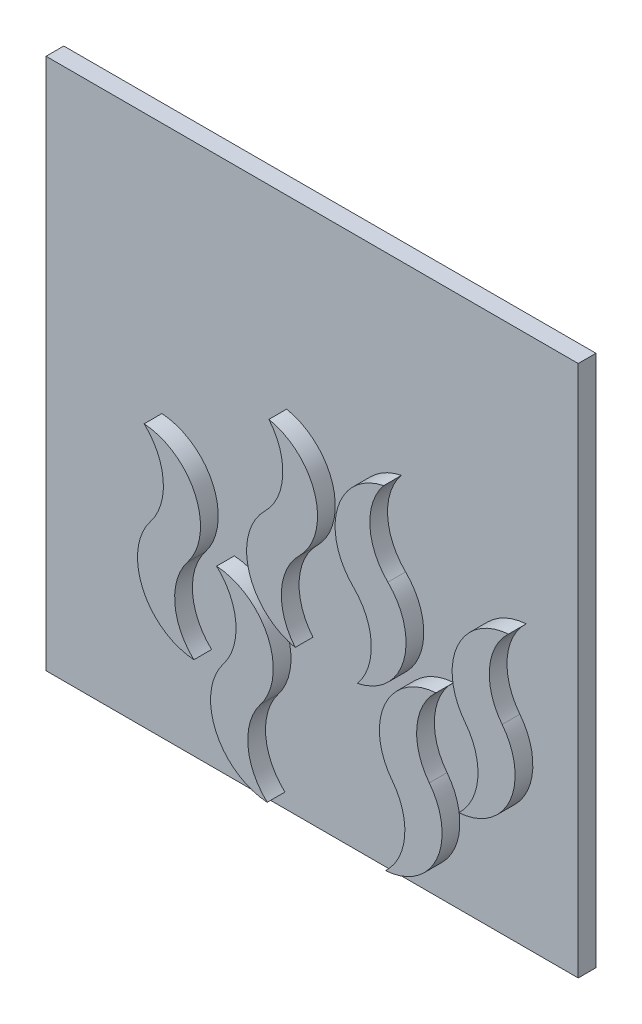
ISO-10303-21;
HEADER;
FILE_DESCRIPTION(('STEP AP214'),'2;1');
FILE_NAME('part.step','',(''),(''),'','','');
FILE_SCHEMA(('AUTOMOTIVE_DESIGN { 1 0 10303 214 1 1 1 1 }'));
ENDSEC;
DATA;
#1=APPLICATION_CONTEXT('core data for automotive mechanical design processes');
#2=APPLICATION_PROTOCOL_DEFINITION('international standard','automotive_design',2000,#1);
#3=PRODUCT_CONTEXT('',#1,'mechanical');
#4=PRODUCT('Part','Part','',(#3));
#5=PRODUCT_RELATED_PRODUCT_CATEGORY('part','',(#4));
#6=PRODUCT_DEFINITION_FORMATION('','',#4);
#7=PRODUCT_DEFINITION_CONTEXT('part definition',#1,'design');
#8=PRODUCT_DEFINITION('design','',#6,#7);
#9=PRODUCT_DEFINITION_SHAPE('','',#8);
#10=(LENGTH_UNIT() NAMED_UNIT(*) SI_UNIT(.MILLI.,.METRE.));
#11=(NAMED_UNIT(*) PLANE_ANGLE_UNIT() SI_UNIT($,.RADIAN.));
#12=(NAMED_UNIT(*) SI_UNIT($,.STERADIAN.) SOLID_ANGLE_UNIT());
#13=UNCERTAINTY_MEASURE_WITH_UNIT(LENGTH_MEASURE(1.E-05),#10,'distance_accuracy_value','');
#14=(GEOMETRIC_REPRESENTATION_CONTEXT(3) GLOBAL_UNCERTAINTY_ASSIGNED_CONTEXT((#13)) GLOBAL_UNIT_ASSIGNED_CONTEXT((#10,
#11,#12)) REPRESENTATION_CONTEXT('',''));
#15=CARTESIAN_POINT('',(0.,0.,0.));
#16=DIRECTION('',(0.,0.,1.));
#17=DIRECTION('',(1.,0.,0.));
#18=AXIS2_PLACEMENT_3D('',#15,#16,#17);
#19=CARTESIAN_POINT('',(0.,0.,10.));
#20=DIRECTION('',(0.,0.,-1.));
#21=DIRECTION('',(-1.,0.,0.));
#22=AXIS2_PLACEMENT_3D('',#19,#20,#21);
#23=PLANE('',#22);
#24=CARTESIAN_POINT('',(226.521788907777,173.848705090708,10.));
#25=DIRECTION('',(0.,0.,-1.));
#26=DIRECTION('',(-1.,0.,0.));
#27=AXIS2_PLACEMENT_3D('',#24,#25,#26);
#28=CIRCLE('',#27,34.0058100788832);
#29=CARTESIAN_POINT('',(202.692247838287,149.588694960072,10.));
#30=VERTEX_POINT('',#29);
#31=CARTESIAN_POINT('',(200.348155145126,195.558979496613,10.));
#32=VERTEX_POINT('',#31);
#33=EDGE_CURVE('E229',#30,#32,#28,.T.);
#34=ORIENTED_EDGE('',*,*,#33,.F.);
#35=CARTESIAN_POINT('',(178.6971316033,125.160118629163,10.));
#36=DIRECTION('',(0.,0.,1.));
#37=DIRECTION('',(-1.,0.,0.));
#38=AXIS2_PLACEMENT_3D('',#35,#36,#37);
#39=CIRCLE('',#38,34.2420931703302);
#40=CARTESIAN_POINT('',(185.539126914538,91.6085457175006,10.));
#41=VERTEX_POINT('',#40);
#42=EDGE_CURVE('E232',#41,#30,#39,.T.);
#43=ORIENTED_EDGE('',*,*,#42,.F.);
#44=CARTESIAN_POINT('',(159.365493151887,113.318820123406,10.));
#45=DIRECTION('',(0.,0.,-1.));
#46=DIRECTION('',(-1.,0.,0.));
#47=AXIS2_PLACEMENT_3D('',#44,#45,#46);
#48=CIRCLE('',#47,34.0058100788832);
#49=CARTESIAN_POINT('',(183.195034221377,137.578830254042,10.));
#50=VERTEX_POINT('',#49);
#51=EDGE_CURVE('E68',#50,#41,#48,.T.);
#52=ORIENTED_EDGE('',*,*,#51,.F.);
#53=CARTESIAN_POINT('',(207.190150456364,162.007406584951,10.));
#54=DIRECTION('',(0.,0.,1.));
#55=DIRECTION('',(-1.,0.,0.));
#56=AXIS2_PLACEMENT_3D('',#53,#54,#55);
#57=CIRCLE('',#56,34.2420931703302);
#58=EDGE_CURVE('E63',#32,#50,#57,.T.);
#59=ORIENTED_EDGE('',*,*,#58,.F.);
#60=EDGE_LOOP('',(#34,#43,#52,#59));
#61=FACE_BOUND('',#60,.T.);
#62=CARTESIAN_POINT('',(252.901161003334,84.1522893217765,10.));
#63=DIRECTION('',(0.,0.,-1.));
#64=DIRECTION('',(-1.,0.,0.));
#65=AXIS2_PLACEMENT_3D('',#62,#63,#64);
#66=CIRCLE('',#65,34.0058100788831);
#67=CARTESIAN_POINT('',(226.051898305142,63.2833599844937,10.));
#68=VERTEX_POINT('',#67);
#69=CARTESIAN_POINT('',(229.853318045369,109.156130108864,10.));
#70=VERTEX_POINT('',#69);
#71=EDGE_CURVE('E306',#68,#70,#66,.T.);
#72=ORIENTED_EDGE('',*,*,#71,.F.);
#73=CARTESIAN_POINT('',(199.01607846337,42.2694267455962,10.));
#74=DIRECTION('',(0.,0.,1.));
#75=DIRECTION('',(-1.,0.,0.));
#76=AXIS2_PLACEMENT_3D('',#73,#74,#75);
#77=CIRCLE('',#76,34.2420931703302);
#78=CARTESIAN_POINT('',(201.327006661684,8.10540245764366,10.));
#79=VERTEX_POINT('',#78);
#80=EDGE_CURVE('E293',#79,#68,#77,.T.);
#81=ORIENTED_EDGE('',*,*,#80,.F.);
#82=CARTESIAN_POINT('',(178.279163703718,33.109243244731,10.));
#83=DIRECTION('',(0.,0.,-1.));
#84=DIRECTION('',(-1.,0.,0.));
#85=AXIS2_PLACEMENT_3D('',#82,#83,#84);
#86=CIRCLE('',#85,34.0058100788832);
#87=CARTESIAN_POINT('',(205.128426401911,53.9781725820139,10.));
#88=VERTEX_POINT('',#87);
#89=EDGE_CURVE('E297',#88,#79,#86,.T.);
#90=ORIENTED_EDGE('',*,*,#89,.F.);
#91=CARTESIAN_POINT('',(232.164246243683,74.9921058209113,10.));
#92=DIRECTION('',(0.,0.,1.));
#93=DIRECTION('',(-1.,0.,0.));
#94=AXIS2_PLACEMENT_3D('',#91,#92,#93);
#95=CIRCLE('',#94,34.2420931703302);
#96=EDGE_CURVE('E302',#70,#88,#95,.T.);
#97=ORIENTED_EDGE('',*,*,#96,.F.);
#98=EDGE_LOOP('',(#72,#81,#90,#97));
#99=FACE_BOUND('',#98,.T.);
#100=CARTESIAN_POINT('',(103.835753756317,74.9921058209113,10.));
#101=DIRECTION('',(0.,0.,1.));
#102=DIRECTION('',(1.,0.,0.));
#103=AXIS2_PLACEMENT_3D('',#100,#101,#102);
#104=CIRCLE('',#103,34.2420931703302);
#105=CARTESIAN_POINT('',(130.871573598089,53.9781725820139,10.));
#106=VERTEX_POINT('',#105);
#107=CARTESIAN_POINT('',(106.146681954631,109.156130108864,10.));
#108=VERTEX_POINT('',#107);
#109=EDGE_CURVE('E396',#106,#108,#104,.T.);
#110=ORIENTED_EDGE('',*,*,#109,.F.);
#111=CARTESIAN_POINT('',(157.720836296282,33.109243244731,10.));
#112=DIRECTION('',(0.,0.,-1.));
#113=DIRECTION('',(1.,0.,0.));
#114=AXIS2_PLACEMENT_3D('',#111,#112,#113);
#115=CIRCLE('',#114,34.0058100788832);
#116=CARTESIAN_POINT('',(134.672993338316,8.10540245764366,10.));
#117=VERTEX_POINT('',#116);
#118=EDGE_CURVE('E383',#117,#106,#115,.T.);
#119=ORIENTED_EDGE('',*,*,#118,.F.);
#120=CARTESIAN_POINT('',(136.98392153663,42.2694267455962,10.));
#121=DIRECTION('',(0.,0.,1.));
#122=DIRECTION('',(1.,0.,0.));
#123=AXIS2_PLACEMENT_3D('',#120,#121,#122);
#124=CIRCLE('',#123,34.2420931703302);
#125=CARTESIAN_POINT('',(109.948101694858,63.2833599844937,10.));
#126=VERTEX_POINT('',#125);
#127=EDGE_CURVE('E387',#126,#117,#124,.T.);
#128=ORIENTED_EDGE('',*,*,#127,.F.);
#129=CARTESIAN_POINT('',(83.0988389966655,84.1522893217765,10.));
#130=DIRECTION('',(0.,0.,-1.));
#131=DIRECTION('',(1.,0.,0.));
#132=AXIS2_PLACEMENT_3D('',#129,#130,#131);
#133=CIRCLE('',#132,34.0058100788831);
#134=EDGE_CURVE('E392',#108,#126,#133,.T.);
#135=ORIENTED_EDGE('',*,*,#134,.F.);
#136=EDGE_LOOP('',(#110,#119,#128,#135));
#137=FACE_BOUND('',#136,.T.);
#138=CARTESIAN_POINT('',(219.495258599594,81.9190017693389,10.));
#139=DIRECTION('',(0.,0.,-1.));
#140=DIRECTION('',(-1.,0.,0.));
#141=AXIS2_PLACEMENT_3D('',#138,#139,#140);
#142=CIRCLE('',#141,34.0058100788832);
#143=CARTESIAN_POINT('',(246.236441483387,102.926244736863,10.));
#144=VERTEX_POINT('',#143);
#145=CARTESIAN_POINT('',(242.671860382951,57.0344634192557,10.));
#146=VERTEX_POINT('',#145);
#147=EDGE_CURVE('E441',#144,#146,#142,.T.);
#148=ORIENTED_EDGE('',*,*,#147,.F.);
#149=CARTESIAN_POINT('',(273.163430538128,124.079452652719,10.));
#150=DIRECTION('',(0.,0.,1.));
#151=DIRECTION('',(-1.,0.,0.));
#152=AXIS2_PLACEMENT_3D('',#149,#150,#151);
#153=CIRCLE('',#152,34.2420931703302);
#154=CARTESIAN_POINT('',(270.67618382826,158.231093147575,10.));
#155=VERTEX_POINT('',#154);
#156=EDGE_CURVE('E428',#155,#144,#153,.T.);
#157=ORIENTED_EDGE('',*,*,#156,.F.);
#158=CARTESIAN_POINT('',(293.852785611618,133.346554797491,10.));
#159=DIRECTION('',(0.,0.,-1.));
#160=DIRECTION('',(-1.,0.,0.));
#161=AXIS2_PLACEMENT_3D('',#158,#159,#160);
#162=CIRCLE('',#161,34.0058100788832);
#163=CARTESIAN_POINT('',(267.111602727824,112.339311829967,10.));
#164=VERTEX_POINT('',#163);
#165=EDGE_CURVE('E432',#164,#155,#162,.T.);
#166=ORIENTED_EDGE('',*,*,#165,.F.);
#167=CARTESIAN_POINT('',(240.184613673084,91.1861039141109,10.));
#168=DIRECTION('',(0.,0.,1.));
#169=DIRECTION('',(-1.,0.,0.));
#170=AXIS2_PLACEMENT_3D('',#167,#168,#169);
#171=CIRCLE('',#170,34.2420931703302);
#172=EDGE_CURVE('E437',#146,#164,#171,.T.);
#173=ORIENTED_EDGE('',*,*,#172,.F.);
#174=EDGE_LOOP('',(#148,#157,#166,#173));
#175=FACE_BOUND('',#174,.T.);
#176=DIRECTION('',(0.,-1.,0.));
#177=VECTOR('',#176,1.);
#178=CARTESIAN_POINT('',(0.,0.,10.));
#179=LINE('',#178,#177);
#180=CARTESIAN_POINT('',(0.,300.,10.));
#181=VERTEX_POINT('',#180);
#182=CARTESIAN_POINT('',(0.,0.,10.));
#183=VERTEX_POINT('',#182);
#184=EDGE_CURVE('E502',#181,#183,#179,.T.);
#185=ORIENTED_EDGE('',*,*,#184,.T.);
#186=DIRECTION('',(1.,0.,0.));
#187=VECTOR('',#186,1.);
#188=CARTESIAN_POINT('',(0.,0.,10.));
#189=LINE('',#188,#187);
#190=CARTESIAN_POINT('',(300.,0.,10.));
#191=VERTEX_POINT('',#190);
#192=EDGE_CURVE('E506',#183,#191,#189,.T.);
#193=ORIENTED_EDGE('',*,*,#192,.T.);
#194=DIRECTION('',(0.,1.,0.));
#195=VECTOR('',#194,1.);
#196=CARTESIAN_POINT('',(300.,0.,10.));
#197=LINE('',#196,#195);
#198=CARTESIAN_POINT('',(300.,300.,10.));
#199=VERTEX_POINT('',#198);
#200=EDGE_CURVE('E510',#191,#199,#197,.T.);
#201=ORIENTED_EDGE('',*,*,#200,.T.);
#202=DIRECTION('',(-1.,0.,0.));
#203=VECTOR('',#202,1.);
#204=CARTESIAN_POINT('',(0.,300.,10.));
#205=LINE('',#204,#203);
#206=EDGE_CURVE('E513',#199,#181,#205,.T.);
#207=ORIENTED_EDGE('',*,*,#206,.T.);
#208=EDGE_LOOP('',(#185,#193,#201,#207));
#209=FACE_BOUND('',#208,.T.);
#210=CARTESIAN_POINT('',(62.8365694618724,124.079452652719,10.));
#211=DIRECTION('',(0.,0.,1.));
#212=DIRECTION('',(1.,0.,0.));
#213=AXIS2_PLACEMENT_3D('',#210,#211,#212);
#214=CIRCLE('',#213,34.2420931703302);
#215=CARTESIAN_POINT('',(89.7635585166133,102.926244736863,10.));
#216=VERTEX_POINT('',#215);
#217=CARTESIAN_POINT('',(65.3238161717396,158.231093147575,10.));
#218=VERTEX_POINT('',#217);
#219=EDGE_CURVE('E445',#216,#218,#214,.T.);
#220=ORIENTED_EDGE('',*,*,#219,.F.);
#221=CARTESIAN_POINT('',(116.504741400406,81.9190017693389,10.));
#222=DIRECTION('',(0.,0.,-1.));
#223=DIRECTION('',(1.,0.,0.));
#224=AXIS2_PLACEMENT_3D('',#221,#222,#223);
#225=CIRCLE('',#224,34.0058100788832);
#226=CARTESIAN_POINT('',(93.3281396170492,57.0344634192557,10.));
#227=VERTEX_POINT('',#226);
#228=EDGE_CURVE('E462',#227,#216,#225,.T.);
#229=ORIENTED_EDGE('',*,*,#228,.F.);
#230=CARTESIAN_POINT('',(95.8153863269165,91.1861039141109,10.));
#231=DIRECTION('',(0.,0.,1.));
#232=DIRECTION('',(1.,0.,0.));
#233=AXIS2_PLACEMENT_3D('',#230,#231,#232);
#234=CIRCLE('',#233,34.2420931703302);
#235=CARTESIAN_POINT('',(68.8883972721756,112.339311829967,10.));
#236=VERTEX_POINT('',#235);
#237=EDGE_CURVE('E479',#236,#227,#234,.T.);
#238=ORIENTED_EDGE('',*,*,#237,.F.);
#239=CARTESIAN_POINT('',(42.1472143883825,133.346554797491,10.));
#240=DIRECTION('',(0.,0.,-1.));
#241=DIRECTION('',(1.,0.,0.));
#242=AXIS2_PLACEMENT_3D('',#239,#240,#241);
#243=CIRCLE('',#242,34.0058100788832);
#244=EDGE_CURVE('E475',#218,#236,#243,.T.);
#245=ORIENTED_EDGE('',*,*,#244,.F.);
#246=EDGE_LOOP('',(#220,#229,#238,#245));
#247=FACE_BOUND('',#246,.T.);
#248=CARTESIAN_POINT('',(128.809849543636,162.007406584951,10.));
#249=DIRECTION('',(0.,0.,1.));
#250=DIRECTION('',(1.,0.,0.));
#251=AXIS2_PLACEMENT_3D('',#248,#249,#250);
#252=CIRCLE('',#251,34.2420931703302);
#253=CARTESIAN_POINT('',(152.804965778623,137.578830254042,10.));
#254=VERTEX_POINT('',#253);
#255=CARTESIAN_POINT('',(135.651844854874,195.558979496613,10.));
#256=VERTEX_POINT('',#255);
#257=EDGE_CURVE('E351',#254,#256,#252,.T.);
#258=ORIENTED_EDGE('',*,*,#257,.F.);
#259=CARTESIAN_POINT('',(176.634506848113,113.318820123406,10.));
#260=DIRECTION('',(0.,0.,-1.));
#261=DIRECTION('',(1.,0.,0.));
#262=AXIS2_PLACEMENT_3D('',#259,#260,#261);
#263=CIRCLE('',#262,34.0058100788832);
#264=CARTESIAN_POINT('',(150.460873085462,91.6085457175005,10.));
#265=VERTEX_POINT('',#264);
#266=EDGE_CURVE('E338',#265,#254,#263,.T.);
#267=ORIENTED_EDGE('',*,*,#266,.F.);
#268=CARTESIAN_POINT('',(157.3028683967,125.160118629163,10.));
#269=DIRECTION('',(0.,0.,1.));
#270=DIRECTION('',(1.,0.,0.));
#271=AXIS2_PLACEMENT_3D('',#268,#269,#270);
#272=CIRCLE('',#271,34.2420931703302);
#273=CARTESIAN_POINT('',(133.307752161713,149.588694960072,10.));
#274=VERTEX_POINT('',#273);
#275=EDGE_CURVE('E342',#274,#265,#272,.T.);
#276=ORIENTED_EDGE('',*,*,#275,.F.);
#277=CARTESIAN_POINT('',(109.478211092223,173.848705090708,10.));
#278=DIRECTION('',(0.,0.,-1.));
#279=DIRECTION('',(1.,0.,0.));
#280=AXIS2_PLACEMENT_3D('',#277,#278,#279);
#281=CIRCLE('',#280,34.0058100788832);
#282=EDGE_CURVE('E347',#256,#274,#281,.T.);
#283=ORIENTED_EDGE('',*,*,#282,.F.);
#284=EDGE_LOOP('',(#258,#267,#276,#283));
#285=FACE_BOUND('',#284,.T.);
#286=ADVANCED_FACE('F47',(#61,#99,#137,#175,#209,#247,#285),#23,.F.);
#287=CARTESIAN_POINT('',(0.,0.,10.));
#288=DIRECTION('',(1.,0.,0.));
#289=DIRECTION('',(0.,0.,-1.));
#290=AXIS2_PLACEMENT_3D('',#287,#288,#289);
#291=PLANE('',#290);
#292=DIRECTION('',(0.,-1.,0.));
#293=VECTOR('',#292,1.);
#294=CARTESIAN_POINT('',(0.,0.,0.));
#295=LINE('',#294,#293);
#296=CARTESIAN_POINT('',(0.,300.,0.));
#297=VERTEX_POINT('',#296);
#298=CARTESIAN_POINT('',(0.,0.,0.));
#299=VERTEX_POINT('',#298);
#300=EDGE_CURVE('E501',#297,#299,#295,.T.);
#301=ORIENTED_EDGE('',*,*,#300,.T.);
#302=DIRECTION('',(0.,0.,-1.));
#303=VECTOR('',#302,1.);
#304=CARTESIAN_POINT('',(0.,0.,10.));
#305=LINE('',#304,#303);
#306=EDGE_CURVE('E11',#183,#299,#305,.T.);
#307=ORIENTED_EDGE('',*,*,#306,.F.);
#308=ORIENTED_EDGE('',*,*,#184,.F.);
#309=DIRECTION('',(0.,0.,-1.));
#310=VECTOR('',#309,1.);
#311=CARTESIAN_POINT('',(0.,300.,10.));
#312=LINE('',#311,#310);
#313=EDGE_CURVE('E516',#181,#297,#312,.T.);
#314=ORIENTED_EDGE('',*,*,#313,.T.);
#315=EDGE_LOOP('',(#301,#307,#308,#314));
#316=FACE_BOUND('',#315,.T.);
#317=ADVANCED_FACE('F49',(#316),#291,.F.);
#318=CARTESIAN_POINT('',(0.,0.,10.));
#319=DIRECTION('',(0.,1.,0.));
#320=DIRECTION('',(0.,0.,1.));
#321=AXIS2_PLACEMENT_3D('',#318,#319,#320);
#322=PLANE('',#321);
#323=DIRECTION('',(1.,0.,0.));
#324=VECTOR('',#323,1.);
#325=CARTESIAN_POINT('',(0.,0.,0.));
#326=LINE('',#325,#324);
#327=CARTESIAN_POINT('',(300.,0.,0.));
#328=VERTEX_POINT('',#327);
#329=EDGE_CURVE('E520',#299,#328,#326,.T.);
#330=ORIENTED_EDGE('',*,*,#329,.T.);
#331=DIRECTION('',(0.,0.,-1.));
#332=VECTOR('',#331,1.);
#333=CARTESIAN_POINT('',(300.,0.,10.));
#334=LINE('',#333,#332);
#335=EDGE_CURVE('E56',#191,#328,#334,.T.);
#336=ORIENTED_EDGE('',*,*,#335,.F.);
#337=ORIENTED_EDGE('',*,*,#192,.F.);
#338=ORIENTED_EDGE('',*,*,#306,.T.);
#339=EDGE_LOOP('',(#330,#336,#337,#338));
#340=FACE_BOUND('',#339,.T.);
#341=ADVANCED_FACE('F558',(#340),#322,.F.);
#342=CARTESIAN_POINT('',(300.,0.,10.));
#343=DIRECTION('',(-1.,0.,0.));
#344=DIRECTION('',(0.,0.,1.));
#345=AXIS2_PLACEMENT_3D('',#342,#343,#344);
#346=PLANE('',#345);
#347=DIRECTION('',(0.,1.,0.));
#348=VECTOR('',#347,1.);
#349=CARTESIAN_POINT('',(300.,0.,0.));
#350=LINE('',#349,#348);
#351=CARTESIAN_POINT('',(300.,300.,0.));
#352=VERTEX_POINT('',#351);
#353=EDGE_CURVE('E523',#328,#352,#350,.T.);
#354=ORIENTED_EDGE('',*,*,#353,.T.);
#355=DIRECTION('',(0.,0.,-1.));
#356=VECTOR('',#355,1.);
#357=CARTESIAN_POINT('',(300.,300.,10.));
#358=LINE('',#357,#356);
#359=EDGE_CURVE('E531',#199,#352,#358,.T.);
#360=ORIENTED_EDGE('',*,*,#359,.F.);
#361=ORIENTED_EDGE('',*,*,#200,.F.);
#362=ORIENTED_EDGE('',*,*,#335,.T.);
#363=EDGE_LOOP('',(#354,#360,#361,#362));
#364=FACE_BOUND('',#363,.T.);
#365=ADVANCED_FACE('F542',(#364),#346,.F.);
#366=CARTESIAN_POINT('',(0.,300.,10.));
#367=DIRECTION('',(0.,-1.,0.));
#368=DIRECTION('',(0.,0.,-1.));
#369=AXIS2_PLACEMENT_3D('',#366,#367,#368);
#370=PLANE('',#369);
#371=DIRECTION('',(-1.,0.,0.));
#372=VECTOR('',#371,1.);
#373=CARTESIAN_POINT('',(0.,300.,0.));
#374=LINE('',#373,#372);
#375=EDGE_CURVE('E507',#352,#297,#374,.T.);
#376=ORIENTED_EDGE('',*,*,#375,.T.);
#377=ORIENTED_EDGE('',*,*,#313,.F.);
#378=ORIENTED_EDGE('',*,*,#206,.F.);
#379=ORIENTED_EDGE('',*,*,#359,.T.);
#380=EDGE_LOOP('',(#376,#377,#378,#379));
#381=FACE_BOUND('',#380,.T.);
#382=ADVANCED_FACE('F551',(#381),#370,.F.);
#383=CARTESIAN_POINT('',(0.,0.,0.));
#384=DIRECTION('',(0.,0.,-1.));
#385=DIRECTION('',(-1.,0.,0.));
#386=AXIS2_PLACEMENT_3D('',#383,#384,#385);
#387=PLANE('',#386);
#388=ORIENTED_EDGE('',*,*,#300,.F.);
#389=ORIENTED_EDGE('',*,*,#375,.F.);
#390=ORIENTED_EDGE('',*,*,#353,.F.);
#391=ORIENTED_EDGE('',*,*,#329,.F.);
#392=EDGE_LOOP('',(#388,#389,#390,#391));
#393=FACE_BOUND('',#392,.T.);
#394=ADVANCED_FACE('F548',(#393),#387,.T.);
#395=CARTESIAN_POINT('',(62.8365694618724,124.079452652719,20.));
#396=DIRECTION('',(0.,0.,-1.));
#397=DIRECTION('',(-1.,0.,0.));
#398=AXIS2_PLACEMENT_3D('',#395,#396,#397);
#399=CYLINDRICAL_SURFACE('',#398,34.2420931703302);
#400=ORIENTED_EDGE('',*,*,#219,.T.);
#401=DIRECTION('',(0.,0.,-1.));
#402=VECTOR('',#401,1.);
#403=CARTESIAN_POINT('',(65.3238161717396,158.231093147575,20.));
#404=LINE('',#403,#402);
#405=CARTESIAN_POINT('',(65.3238161717396,158.231093147575,20.));
#406=VERTEX_POINT('',#405);
#407=EDGE_CURVE('E497',#406,#218,#404,.T.);
#408=ORIENTED_EDGE('',*,*,#407,.F.);
#409=CARTESIAN_POINT('',(62.8365694618724,124.079452652719,20.));
#410=DIRECTION('',(0.,0.,1.));
#411=DIRECTION('',(1.,0.,0.));
#412=AXIS2_PLACEMENT_3D('',#409,#410,#411);
#413=CIRCLE('',#412,34.2420931703302);
#414=CARTESIAN_POINT('',(89.7635585166133,102.926244736863,20.));
#415=VERTEX_POINT('',#414);
#416=EDGE_CURVE('E457',#415,#406,#413,.T.);
#417=ORIENTED_EDGE('',*,*,#416,.F.);
#418=DIRECTION('',(0.,0.,-1.));
#419=VECTOR('',#418,1.);
#420=CARTESIAN_POINT('',(89.7635585166133,102.926244736863,20.));
#421=LINE('',#420,#419);
#422=EDGE_CURVE('E471',#415,#216,#421,.T.);
#423=ORIENTED_EDGE('',*,*,#422,.T.);
#424=EDGE_LOOP('',(#400,#408,#417,#423));
#425=FACE_BOUND('',#424,.T.);
#426=ADVANCED_FACE('F573',(#425),#399,.T.);
#427=CARTESIAN_POINT('',(42.1472143883825,133.346554797491,20.));
#428=DIRECTION('',(0.,0.,-1.));
#429=DIRECTION('',(-1.,0.,0.));
#430=AXIS2_PLACEMENT_3D('',#427,#428,#429);
#431=CYLINDRICAL_SURFACE('',#430,34.0058100788832);
#432=ORIENTED_EDGE('',*,*,#244,.T.);
#433=DIRECTION('',(0.,0.,-1.));
#434=VECTOR('',#433,1.);
#435=CARTESIAN_POINT('',(68.8883972721756,112.339311829967,20.));
#436=LINE('',#435,#434);
#437=CARTESIAN_POINT('',(68.8883972721756,112.339311829967,20.));
#438=VERTEX_POINT('',#437);
#439=EDGE_CURVE('E493',#438,#236,#436,.T.);
#440=ORIENTED_EDGE('',*,*,#439,.F.);
#441=CARTESIAN_POINT('',(42.1472143883825,133.346554797491,20.));
#442=DIRECTION('',(0.,0.,-1.));
#443=DIRECTION('',(1.,0.,0.));
#444=AXIS2_PLACEMENT_3D('',#441,#442,#443);
#445=CIRCLE('',#444,34.0058100788832);
#446=EDGE_CURVE('E461',#406,#438,#445,.T.);
#447=ORIENTED_EDGE('',*,*,#446,.F.);
#448=ORIENTED_EDGE('',*,*,#407,.T.);
#449=EDGE_LOOP('',(#432,#440,#447,#448));
#450=FACE_BOUND('',#449,.T.);
#451=ADVANCED_FACE('F599',(#450),#431,.F.);
#452=CARTESIAN_POINT('',(95.8153863269165,91.1861039141109,20.));
#453=DIRECTION('',(0.,0.,-1.));
#454=DIRECTION('',(-1.,0.,0.));
#455=AXIS2_PLACEMENT_3D('',#452,#453,#454);
#456=CYLINDRICAL_SURFACE('',#455,34.2420931703302);
#457=ORIENTED_EDGE('',*,*,#237,.T.);
#458=DIRECTION('',(0.,0.,-1.));
#459=VECTOR('',#458,1.);
#460=CARTESIAN_POINT('',(93.3281396170492,57.0344634192557,20.));
#461=LINE('',#460,#459);
#462=CARTESIAN_POINT('',(93.3281396170492,57.0344634192557,20.));
#463=VERTEX_POINT('',#462);
#464=EDGE_CURVE('E489',#463,#227,#461,.T.);
#465=ORIENTED_EDGE('',*,*,#464,.F.);
#466=CARTESIAN_POINT('',(95.8153863269165,91.1861039141109,20.));
#467=DIRECTION('',(0.,0.,1.));
#468=DIRECTION('',(1.,0.,0.));
#469=AXIS2_PLACEMENT_3D('',#466,#467,#468);
#470=CIRCLE('',#469,34.2420931703302);
#471=EDGE_CURVE('E465',#438,#463,#470,.T.);
#472=ORIENTED_EDGE('',*,*,#471,.F.);
#473=ORIENTED_EDGE('',*,*,#439,.T.);
#474=EDGE_LOOP('',(#457,#465,#472,#473));
#475=FACE_BOUND('',#474,.T.);
#476=ADVANCED_FACE('F608',(#475),#456,.T.);
#477=CARTESIAN_POINT('',(116.504741400406,81.9190017693389,20.));
#478=DIRECTION('',(0.,0.,-1.));
#479=DIRECTION('',(-1.,0.,0.));
#480=AXIS2_PLACEMENT_3D('',#477,#478,#479);
#481=CYLINDRICAL_SURFACE('',#480,34.0058100788832);
#482=ORIENTED_EDGE('',*,*,#228,.T.);
#483=ORIENTED_EDGE('',*,*,#422,.F.);
#484=CARTESIAN_POINT('',(116.504741400406,81.9190017693389,20.));
#485=DIRECTION('',(0.,0.,-1.));
#486=DIRECTION('',(1.,0.,0.));
#487=AXIS2_PLACEMENT_3D('',#484,#485,#486);
#488=CIRCLE('',#487,34.0058100788832);
#489=EDGE_CURVE('E468',#463,#415,#488,.T.);
#490=ORIENTED_EDGE('',*,*,#489,.F.);
#491=ORIENTED_EDGE('',*,*,#464,.T.);
#492=EDGE_LOOP('',(#482,#483,#490,#491));
#493=FACE_BOUND('',#492,.T.);
#494=ADVANCED_FACE('F617',(#493),#481,.F.);
#495=CARTESIAN_POINT('',(52.4918919251274,128.713003725105,20.));
#496=DIRECTION('',(0.,0.,1.));
#497=DIRECTION('',(1.,0.,0.));
#498=AXIS2_PLACEMENT_3D('',#495,#496,#497);
#499=PLANE('',#498);
#500=ORIENTED_EDGE('',*,*,#416,.T.);
#501=ORIENTED_EDGE('',*,*,#446,.T.);
#502=ORIENTED_EDGE('',*,*,#471,.T.);
#503=ORIENTED_EDGE('',*,*,#489,.T.);
#504=EDGE_LOOP('',(#500,#501,#502,#503));
#505=FACE_BOUND('',#504,.T.);
#506=ADVANCED_FACE('F627',(#505),#499,.T.);
#507=CARTESIAN_POINT('',(219.495258599594,81.9190017693389,20.));
#508=DIRECTION('',(0.,0.,-1.));
#509=DIRECTION('',(-1.,0.,0.));
#510=AXIS2_PLACEMENT_3D('',#507,#508,#509);
#511=CYLINDRICAL_SURFACE('',#510,34.0058100788832);
#512=ORIENTED_EDGE('',*,*,#147,.T.);
#513=DIRECTION('',(0.,0.,-1.));
#514=VECTOR('',#513,1.);
#515=CARTESIAN_POINT('',(242.671860382951,57.0344634192557,20.));
#516=LINE('',#515,#514);
#517=CARTESIAN_POINT('',(242.671860382951,57.0344634192557,20.));
#518=VERTEX_POINT('',#517);
#519=EDGE_CURVE('E400',#518,#146,#516,.T.);
#520=ORIENTED_EDGE('',*,*,#519,.F.);
#521=CARTESIAN_POINT('',(219.495258599594,81.9190017693389,20.));
#522=DIRECTION('',(0.,0.,-1.));
#523=DIRECTION('',(-1.,0.,0.));
#524=AXIS2_PLACEMENT_3D('',#521,#522,#523);
#525=CIRCLE('',#524,34.0058100788832);
#526=CARTESIAN_POINT('',(246.236441483387,102.926244736863,20.));
#527=VERTEX_POINT('',#526);
#528=EDGE_CURVE('E433',#527,#518,#525,.T.);
#529=ORIENTED_EDGE('',*,*,#528,.F.);
#530=DIRECTION('',(0.,0.,-1.));
#531=VECTOR('',#530,1.);
#532=CARTESIAN_POINT('',(246.236441483387,102.926244736863,20.));
#533=LINE('',#532,#531);
#534=EDGE_CURVE('E423',#527,#144,#533,.T.);
#535=ORIENTED_EDGE('',*,*,#534,.T.);
#536=EDGE_LOOP('',(#512,#520,#529,#535));
#537=FACE_BOUND('',#536,.T.);
#538=ADVANCED_FACE('F637',(#537),#511,.F.);
#539=CARTESIAN_POINT('',(240.184613673084,91.1861039141109,20.));
#540=DIRECTION('',(0.,0.,-1.));
#541=DIRECTION('',(-1.,0.,0.));
#542=AXIS2_PLACEMENT_3D('',#539,#540,#541);
#543=CYLINDRICAL_SURFACE('',#542,34.2420931703302);
#544=ORIENTED_EDGE('',*,*,#172,.T.);
#545=DIRECTION('',(0.,0.,-1.));
#546=VECTOR('',#545,1.);
#547=CARTESIAN_POINT('',(267.111602727824,112.339311829967,20.));
#548=LINE('',#547,#546);
#549=CARTESIAN_POINT('',(267.111602727824,112.339311829967,20.));
#550=VERTEX_POINT('',#549);
#551=EDGE_CURVE('E415',#550,#164,#548,.T.);
#552=ORIENTED_EDGE('',*,*,#551,.F.);
#553=CARTESIAN_POINT('',(240.184613673084,91.1861039141109,20.));
#554=DIRECTION('',(0.,0.,1.));
#555=DIRECTION('',(-1.,0.,0.));
#556=AXIS2_PLACEMENT_3D('',#553,#554,#555);
#557=CIRCLE('',#556,34.2420931703302);
#558=EDGE_CURVE('E451',#518,#550,#557,.T.);
#559=ORIENTED_EDGE('',*,*,#558,.F.);
#560=ORIENTED_EDGE('',*,*,#519,.T.);
#561=EDGE_LOOP('',(#544,#552,#559,#560));
#562=FACE_BOUND('',#561,.T.);
#563=ADVANCED_FACE('F647',(#562),#543,.T.);
#564=CARTESIAN_POINT('',(293.852785611618,133.346554797491,20.));
#565=DIRECTION('',(0.,0.,-1.));
#566=DIRECTION('',(-1.,0.,0.));
#567=AXIS2_PLACEMENT_3D('',#564,#565,#566);
#568=CYLINDRICAL_SURFACE('',#567,34.0058100788832);
#569=ORIENTED_EDGE('',*,*,#165,.T.);
#570=DIRECTION('',(0.,0.,-1.));
#571=VECTOR('',#570,1.);
#572=CARTESIAN_POINT('',(270.67618382826,158.231093147575,20.));
#573=LINE('',#572,#571);
#574=CARTESIAN_POINT('',(270.67618382826,158.231093147575,20.));
#575=VERTEX_POINT('',#574);
#576=EDGE_CURVE('E419',#575,#155,#573,.T.);
#577=ORIENTED_EDGE('',*,*,#576,.F.);
#578=CARTESIAN_POINT('',(293.852785611618,133.346554797491,20.));
#579=DIRECTION('',(0.,0.,-1.));
#580=DIRECTION('',(-1.,0.,0.));
#581=AXIS2_PLACEMENT_3D('',#578,#579,#580);
#582=CIRCLE('',#581,34.0058100788832);
#583=EDGE_CURVE('E448',#550,#575,#582,.T.);
#584=ORIENTED_EDGE('',*,*,#583,.F.);
#585=ORIENTED_EDGE('',*,*,#551,.T.);
#586=EDGE_LOOP('',(#569,#577,#584,#585));
#587=FACE_BOUND('',#586,.T.);
#588=ADVANCED_FACE('F657',(#587),#568,.F.);
#589=CARTESIAN_POINT('',(273.163430538128,124.079452652719,20.));
#590=DIRECTION('',(0.,0.,-1.));
#591=DIRECTION('',(-1.,0.,0.));
#592=AXIS2_PLACEMENT_3D('',#589,#590,#591);
#593=CYLINDRICAL_SURFACE('',#592,34.2420931703302);
#594=ORIENTED_EDGE('',*,*,#156,.T.);
#595=ORIENTED_EDGE('',*,*,#534,.F.);
#596=CARTESIAN_POINT('',(273.163430538128,124.079452652719,20.));
#597=DIRECTION('',(0.,0.,1.));
#598=DIRECTION('',(-1.,0.,0.));
#599=AXIS2_PLACEMENT_3D('',#596,#597,#598);
#600=CIRCLE('',#599,34.2420931703302);
#601=EDGE_CURVE('E427',#575,#527,#600,.T.);
#602=ORIENTED_EDGE('',*,*,#601,.F.);
#603=ORIENTED_EDGE('',*,*,#576,.T.);
#604=EDGE_LOOP('',(#594,#595,#602,#603));
#605=FACE_BOUND('',#604,.T.);
#606=ADVANCED_FACE('F667',(#605),#593,.T.);
#607=CARTESIAN_POINT('',(229.839936136339,86.5525528417249,20.));
#608=DIRECTION('',(0.,0.,-1.));
#609=DIRECTION('',(-1.,0.,0.));
#610=AXIS2_PLACEMENT_3D('',#607,#608,#609);
#611=PLANE('',#610);
#612=ORIENTED_EDGE('',*,*,#528,.T.);
#613=ORIENTED_EDGE('',*,*,#558,.T.);
#614=ORIENTED_EDGE('',*,*,#583,.T.);
#615=ORIENTED_EDGE('',*,*,#601,.T.);
#616=EDGE_LOOP('',(#612,#613,#614,#615));
#617=FACE_BOUND('',#616,.T.);
#618=ADVANCED_FACE('F677',(#617),#611,.F.);
#619=CARTESIAN_POINT('',(103.835753756317,74.9921058209113,20.));
#620=DIRECTION('',(0.,0.,-1.));
#621=DIRECTION('',(-1.,0.,0.));
#622=AXIS2_PLACEMENT_3D('',#619,#620,#621);
#623=CYLINDRICAL_SURFACE('',#622,34.2420931703302);
#624=ORIENTED_EDGE('',*,*,#109,.T.);
#625=DIRECTION('',(0.,0.,-1.));
#626=VECTOR('',#625,1.);
#627=CARTESIAN_POINT('',(106.146681954631,109.156130108864,20.));
#628=LINE('',#627,#626);
#629=CARTESIAN_POINT('',(106.146681954631,109.156130108864,20.));
#630=VERTEX_POINT('',#629);
#631=EDGE_CURVE('E355',#630,#108,#628,.T.);
#632=ORIENTED_EDGE('',*,*,#631,.F.);
#633=CARTESIAN_POINT('',(103.835753756317,74.9921058209113,20.));
#634=DIRECTION('',(0.,0.,1.));
#635=DIRECTION('',(1.,0.,0.));
#636=AXIS2_PLACEMENT_3D('',#633,#634,#635);
#637=CIRCLE('',#636,34.2420931703302);
#638=CARTESIAN_POINT('',(130.871573598089,53.9781725820139,20.));
#639=VERTEX_POINT('',#638);
#640=EDGE_CURVE('E388',#639,#630,#637,.T.);
#641=ORIENTED_EDGE('',*,*,#640,.F.);
#642=DIRECTION('',(0.,0.,-1.));
#643=VECTOR('',#642,1.);
#644=CARTESIAN_POINT('',(130.871573598089,53.9781725820139,20.));
#645=LINE('',#644,#643);
#646=EDGE_CURVE('E378',#639,#106,#645,.T.);
#647=ORIENTED_EDGE('',*,*,#646,.T.);
#648=EDGE_LOOP('',(#624,#632,#641,#647));
#649=FACE_BOUND('',#648,.T.);
#650=ADVANCED_FACE('F687',(#649),#623,.T.);
#651=CARTESIAN_POINT('',(83.0988389966655,84.1522893217765,20.));
#652=DIRECTION('',(0.,0.,-1.));
#653=DIRECTION('',(-1.,0.,0.));
#654=AXIS2_PLACEMENT_3D('',#651,#652,#653);
#655=CYLINDRICAL_SURFACE('',#654,34.0058100788831);
#656=ORIENTED_EDGE('',*,*,#134,.T.);
#657=DIRECTION('',(0.,0.,-1.));
#658=VECTOR('',#657,1.);
#659=CARTESIAN_POINT('',(109.948101694858,63.2833599844937,20.));
#660=LINE('',#659,#658);
#661=CARTESIAN_POINT('',(109.948101694858,63.2833599844937,20.));
#662=VERTEX_POINT('',#661);
#663=EDGE_CURVE('E370',#662,#126,#660,.T.);
#664=ORIENTED_EDGE('',*,*,#663,.F.);
#665=CARTESIAN_POINT('',(83.0988389966655,84.1522893217765,20.));
#666=DIRECTION('',(0.,0.,-1.));
#667=DIRECTION('',(1.,0.,0.));
#668=AXIS2_PLACEMENT_3D('',#665,#666,#667);
#669=CIRCLE('',#668,34.0058100788831);
#670=EDGE_CURVE('E406',#630,#662,#669,.T.);
#671=ORIENTED_EDGE('',*,*,#670,.F.);
#672=ORIENTED_EDGE('',*,*,#631,.T.);
#673=EDGE_LOOP('',(#656,#664,#671,#672));
#674=FACE_BOUND('',#673,.T.);
#675=ADVANCED_FACE('F697',(#674),#655,.F.);
#676=CARTESIAN_POINT('',(136.98392153663,42.2694267455962,20.));
#677=DIRECTION('',(0.,0.,-1.));
#678=DIRECTION('',(-1.,0.,0.));
#679=AXIS2_PLACEMENT_3D('',#676,#677,#678);
#680=CYLINDRICAL_SURFACE('',#679,34.2420931703302);
#681=ORIENTED_EDGE('',*,*,#127,.T.);
#682=DIRECTION('',(0.,0.,-1.));
#683=VECTOR('',#682,1.);
#684=CARTESIAN_POINT('',(134.672993338316,8.10540245764367,20.));
#685=LINE('',#684,#683);
#686=CARTESIAN_POINT('',(134.672993338316,8.10540245764367,20.));
#687=VERTEX_POINT('',#686);
#688=EDGE_CURVE('E374',#687,#117,#685,.T.);
#689=ORIENTED_EDGE('',*,*,#688,.F.);
#690=CARTESIAN_POINT('',(136.98392153663,42.2694267455962,20.));
#691=DIRECTION('',(0.,0.,1.));
#692=DIRECTION('',(1.,0.,0.));
#693=AXIS2_PLACEMENT_3D('',#690,#691,#692);
#694=CIRCLE('',#693,34.2420931703302);
#695=EDGE_CURVE('E403',#662,#687,#694,.T.);
#696=ORIENTED_EDGE('',*,*,#695,.F.);
#697=ORIENTED_EDGE('',*,*,#663,.T.);
#698=EDGE_LOOP('',(#681,#689,#696,#697));
#699=FACE_BOUND('',#698,.T.);
#700=ADVANCED_FACE('F707',(#699),#680,.T.);
#701=CARTESIAN_POINT('',(157.720836296282,33.109243244731,20.));
#702=DIRECTION('',(0.,0.,-1.));
#703=DIRECTION('',(-1.,0.,0.));
#704=AXIS2_PLACEMENT_3D('',#701,#702,#703);
#705=CYLINDRICAL_SURFACE('',#704,34.0058100788832);
#706=ORIENTED_EDGE('',*,*,#118,.T.);
#707=ORIENTED_EDGE('',*,*,#646,.F.);
#708=CARTESIAN_POINT('',(157.720836296282,33.109243244731,20.));
#709=DIRECTION('',(0.,0.,-1.));
#710=DIRECTION('',(1.,0.,0.));
#711=AXIS2_PLACEMENT_3D('',#708,#709,#710);
#712=CIRCLE('',#711,34.0058100788832);
#713=EDGE_CURVE('E382',#687,#639,#712,.T.);
#714=ORIENTED_EDGE('',*,*,#713,.F.);
#715=ORIENTED_EDGE('',*,*,#688,.T.);
#716=EDGE_LOOP('',(#706,#707,#714,#715));
#717=FACE_BOUND('',#716,.T.);
#718=ADVANCED_FACE('F717',(#717),#705,.F.);
#719=CARTESIAN_POINT('',(93.4672963764914,79.5721975713439,20.));
#720=DIRECTION('',(0.,0.,1.));
#721=DIRECTION('',(1.,0.,0.));
#722=AXIS2_PLACEMENT_3D('',#719,#720,#721);
#723=PLANE('',#722);
#724=ORIENTED_EDGE('',*,*,#640,.T.);
#725=ORIENTED_EDGE('',*,*,#670,.T.);
#726=ORIENTED_EDGE('',*,*,#695,.T.);
#727=ORIENTED_EDGE('',*,*,#713,.T.);
#728=EDGE_LOOP('',(#724,#725,#726,#727));
#729=FACE_BOUND('',#728,.T.);
#730=ADVANCED_FACE('F727',(#729),#723,.T.);
#731=CARTESIAN_POINT('',(128.809849543636,162.007406584951,20.));
#732=DIRECTION('',(0.,0.,-1.));
#733=DIRECTION('',(-1.,0.,0.));
#734=AXIS2_PLACEMENT_3D('',#731,#732,#733);
#735=CYLINDRICAL_SURFACE('',#734,34.2420931703302);
#736=ORIENTED_EDGE('',*,*,#257,.T.);
#737=DIRECTION('',(0.,0.,-1.));
#738=VECTOR('',#737,1.);
#739=CARTESIAN_POINT('',(135.651844854874,195.558979496613,20.));
#740=LINE('',#739,#738);
#741=CARTESIAN_POINT('',(135.651844854874,195.558979496613,20.));
#742=VERTEX_POINT('',#741);
#743=EDGE_CURVE('E310',#742,#256,#740,.T.);
#744=ORIENTED_EDGE('',*,*,#743,.F.);
#745=CARTESIAN_POINT('',(128.809849543636,162.007406584951,20.));
#746=DIRECTION('',(0.,0.,1.));
#747=DIRECTION('',(1.,0.,0.));
#748=AXIS2_PLACEMENT_3D('',#745,#746,#747);
#749=CIRCLE('',#748,34.2420931703302);
#750=CARTESIAN_POINT('',(152.804965778623,137.578830254042,20.));
#751=VERTEX_POINT('',#750);
#752=EDGE_CURVE('E343',#751,#742,#749,.T.);
#753=ORIENTED_EDGE('',*,*,#752,.F.);
#754=DIRECTION('',(0.,0.,-1.));
#755=VECTOR('',#754,1.);
#756=CARTESIAN_POINT('',(152.804965778623,137.578830254042,20.));
#757=LINE('',#756,#755);
#758=EDGE_CURVE('E333',#751,#254,#757,.T.);
#759=ORIENTED_EDGE('',*,*,#758,.T.);
#760=EDGE_LOOP('',(#736,#744,#753,#759));
#761=FACE_BOUND('',#760,.T.);
#762=ADVANCED_FACE('F737',(#761),#735,.T.);
#763=CARTESIAN_POINT('',(109.478211092223,173.848705090708,20.));
#764=DIRECTION('',(0.,0.,-1.));
#765=DIRECTION('',(-1.,0.,0.));
#766=AXIS2_PLACEMENT_3D('',#763,#764,#765);
#767=CYLINDRICAL_SURFACE('',#766,34.0058100788832);
#768=ORIENTED_EDGE('',*,*,#282,.T.);
#769=DIRECTION('',(0.,0.,-1.));
#770=VECTOR('',#769,1.);
#771=CARTESIAN_POINT('',(133.307752161713,149.588694960072,20.));
#772=LINE('',#771,#770);
#773=CARTESIAN_POINT('',(133.307752161713,149.588694960072,20.));
#774=VERTEX_POINT('',#773);
#775=EDGE_CURVE('E325',#774,#274,#772,.T.);
#776=ORIENTED_EDGE('',*,*,#775,.F.);
#777=CARTESIAN_POINT('',(109.478211092223,173.848705090708,20.));
#778=DIRECTION('',(0.,0.,-1.));
#779=DIRECTION('',(1.,0.,0.));
#780=AXIS2_PLACEMENT_3D('',#777,#778,#779);
#781=CIRCLE('',#780,34.0058100788832);
#782=EDGE_CURVE('E361',#742,#774,#781,.T.);
#783=ORIENTED_EDGE('',*,*,#782,.F.);
#784=ORIENTED_EDGE('',*,*,#743,.T.);
#785=EDGE_LOOP('',(#768,#776,#783,#784));
#786=FACE_BOUND('',#785,.T.);
#787=ADVANCED_FACE('F747',(#786),#767,.F.);
#788=CARTESIAN_POINT('',(157.3028683967,125.160118629163,20.));
#789=DIRECTION('',(0.,0.,-1.));
#790=DIRECTION('',(-1.,0.,0.));
#791=AXIS2_PLACEMENT_3D('',#788,#789,#790);
#792=CYLINDRICAL_SURFACE('',#791,34.2420931703302);
#793=ORIENTED_EDGE('',*,*,#275,.T.);
#794=DIRECTION('',(0.,0.,-1.));
#795=VECTOR('',#794,1.);
#796=CARTESIAN_POINT('',(150.460873085462,91.6085457175005,20.));
#797=LINE('',#796,#795);
#798=CARTESIAN_POINT('',(150.460873085462,91.6085457175005,20.));
#799=VERTEX_POINT('',#798);
#800=EDGE_CURVE('E329',#799,#265,#797,.T.);
#801=ORIENTED_EDGE('',*,*,#800,.F.);
#802=CARTESIAN_POINT('',(157.3028683967,125.160118629163,20.));
#803=DIRECTION('',(0.,0.,1.));
#804=DIRECTION('',(1.,0.,0.));
#805=AXIS2_PLACEMENT_3D('',#802,#803,#804);
#806=CIRCLE('',#805,34.2420931703302);
#807=EDGE_CURVE('E358',#774,#799,#806,.T.);
#808=ORIENTED_EDGE('',*,*,#807,.F.);
#809=ORIENTED_EDGE('',*,*,#775,.T.);
#810=EDGE_LOOP('',(#793,#801,#808,#809));
#811=FACE_BOUND('',#810,.T.);
#812=ADVANCED_FACE('F757',(#811),#792,.T.);
#813=CARTESIAN_POINT('',(176.634506848113,113.318820123406,20.));
#814=DIRECTION('',(0.,0.,-1.));
#815=DIRECTION('',(-1.,0.,0.));
#816=AXIS2_PLACEMENT_3D('',#813,#814,#815);
#817=CYLINDRICAL_SURFACE('',#816,34.0058100788832);
#818=ORIENTED_EDGE('',*,*,#266,.T.);
#819=ORIENTED_EDGE('',*,*,#758,.F.);
#820=CARTESIAN_POINT('',(176.634506848113,113.318820123406,20.));
#821=DIRECTION('',(0.,0.,-1.));
#822=DIRECTION('',(1.,0.,0.));
#823=AXIS2_PLACEMENT_3D('',#820,#821,#822);
#824=CIRCLE('',#823,34.0058100788832);
#825=EDGE_CURVE('E337',#799,#751,#824,.T.);
#826=ORIENTED_EDGE('',*,*,#825,.F.);
#827=ORIENTED_EDGE('',*,*,#800,.T.);
#828=EDGE_LOOP('',(#818,#819,#826,#827));
#829=FACE_BOUND('',#828,.T.);
#830=ADVANCED_FACE('F767',(#829),#817,.F.);
#831=CARTESIAN_POINT('',(119.14403031793,167.928055837829,20.));
#832=DIRECTION('',(0.,0.,1.));
#833=DIRECTION('',(1.,0.,0.));
#834=AXIS2_PLACEMENT_3D('',#831,#832,#833);
#835=PLANE('',#834);
#836=ORIENTED_EDGE('',*,*,#752,.T.);
#837=ORIENTED_EDGE('',*,*,#782,.T.);
#838=ORIENTED_EDGE('',*,*,#807,.T.);
#839=ORIENTED_EDGE('',*,*,#825,.T.);
#840=EDGE_LOOP('',(#836,#837,#838,#839));
#841=FACE_BOUND('',#840,.T.);
#842=ADVANCED_FACE('F777',(#841),#835,.T.);
#843=CARTESIAN_POINT('',(252.901161003334,84.1522893217765,20.));
#844=DIRECTION('',(0.,0.,-1.));
#845=DIRECTION('',(-1.,0.,0.));
#846=AXIS2_PLACEMENT_3D('',#843,#844,#845);
#847=CYLINDRICAL_SURFACE('',#846,34.0058100788831);
#848=ORIENTED_EDGE('',*,*,#71,.T.);
#849=DIRECTION('',(0.,0.,-1.));
#850=VECTOR('',#849,1.);
#851=CARTESIAN_POINT('',(229.853318045369,109.156130108864,20.));
#852=LINE('',#851,#850);
#853=CARTESIAN_POINT('',(229.853318045369,109.156130108864,20.));
#854=VERTEX_POINT('',#853);
#855=EDGE_CURVE('E237',#854,#70,#852,.T.);
#856=ORIENTED_EDGE('',*,*,#855,.F.);
#857=CARTESIAN_POINT('',(252.901161003334,84.1522893217765,20.));
#858=DIRECTION('',(0.,0.,-1.));
#859=DIRECTION('',(-1.,0.,0.));
#860=AXIS2_PLACEMENT_3D('',#857,#858,#859);
#861=CIRCLE('',#860,34.0058100788831);
#862=CARTESIAN_POINT('',(226.051898305142,63.2833599844937,20.));
#863=VERTEX_POINT('',#862);
#864=EDGE_CURVE('E298',#863,#854,#861,.T.);
#865=ORIENTED_EDGE('',*,*,#864,.F.);
#866=DIRECTION('',(0.,0.,-1.));
#867=VECTOR('',#866,1.);
#868=CARTESIAN_POINT('',(226.051898305142,63.2833599844937,20.));
#869=LINE('',#868,#867);
#870=EDGE_CURVE('E288',#863,#68,#869,.T.);
#871=ORIENTED_EDGE('',*,*,#870,.T.);
#872=EDGE_LOOP('',(#848,#856,#865,#871));
#873=FACE_BOUND('',#872,.T.);
#874=ADVANCED_FACE('F787',(#873),#847,.F.);
#875=CARTESIAN_POINT('',(232.164246243683,74.9921058209113,20.));
#876=DIRECTION('',(0.,0.,-1.));
#877=DIRECTION('',(-1.,0.,0.));
#878=AXIS2_PLACEMENT_3D('',#875,#876,#877);
#879=CYLINDRICAL_SURFACE('',#878,34.2420931703302);
#880=ORIENTED_EDGE('',*,*,#96,.T.);
#881=DIRECTION('',(0.,0.,-1.));
#882=VECTOR('',#881,1.);
#883=CARTESIAN_POINT('',(205.128426401911,53.9781725820139,20.));
#884=LINE('',#883,#882);
#885=CARTESIAN_POINT('',(205.128426401911,53.9781725820139,20.));
#886=VERTEX_POINT('',#885);
#887=EDGE_CURVE('E280',#886,#88,#884,.T.);
#888=ORIENTED_EDGE('',*,*,#887,.F.);
#889=CARTESIAN_POINT('',(232.164246243683,74.9921058209113,20.));
#890=DIRECTION('',(0.,0.,1.));
#891=DIRECTION('',(-1.,0.,0.));
#892=AXIS2_PLACEMENT_3D('',#889,#890,#891);
#893=CIRCLE('',#892,34.2420931703302);
#894=EDGE_CURVE('E316',#854,#886,#893,.T.);
#895=ORIENTED_EDGE('',*,*,#894,.F.);
#896=ORIENTED_EDGE('',*,*,#855,.T.);
#897=EDGE_LOOP('',(#880,#888,#895,#896));
#898=FACE_BOUND('',#897,.T.);
#899=ADVANCED_FACE('F797',(#898),#879,.T.);
#900=CARTESIAN_POINT('',(178.279163703718,33.109243244731,20.));
#901=DIRECTION('',(0.,0.,-1.));
#902=DIRECTION('',(-1.,0.,0.));
#903=AXIS2_PLACEMENT_3D('',#900,#901,#902);
#904=CYLINDRICAL_SURFACE('',#903,34.0058100788832);
#905=ORIENTED_EDGE('',*,*,#89,.T.);
#906=DIRECTION('',(0.,0.,-1.));
#907=VECTOR('',#906,1.);
#908=CARTESIAN_POINT('',(201.327006661684,8.10540245764366,20.));
#909=LINE('',#908,#907);
#910=CARTESIAN_POINT('',(201.327006661684,8.10540245764366,20.));
#911=VERTEX_POINT('',#910);
#912=EDGE_CURVE('E284',#911,#79,#909,.T.);
#913=ORIENTED_EDGE('',*,*,#912,.F.);
#914=CARTESIAN_POINT('',(178.279163703718,33.109243244731,20.));
#915=DIRECTION('',(0.,0.,-1.));
#916=DIRECTION('',(-1.,0.,0.));
#917=AXIS2_PLACEMENT_3D('',#914,#915,#916);
#918=CIRCLE('',#917,34.0058100788832);
#919=EDGE_CURVE('E313',#886,#911,#918,.T.);
#920=ORIENTED_EDGE('',*,*,#919,.F.);
#921=ORIENTED_EDGE('',*,*,#887,.T.);
#922=EDGE_LOOP('',(#905,#913,#920,#921));
#923=FACE_BOUND('',#922,.T.);
#924=ADVANCED_FACE('F807',(#923),#904,.F.);
#925=CARTESIAN_POINT('',(199.01607846337,42.2694267455962,20.));
#926=DIRECTION('',(0.,0.,-1.));
#927=DIRECTION('',(-1.,0.,0.));
#928=AXIS2_PLACEMENT_3D('',#925,#926,#927);
#929=CYLINDRICAL_SURFACE('',#928,34.2420931703302);
#930=ORIENTED_EDGE('',*,*,#80,.T.);
#931=ORIENTED_EDGE('',*,*,#870,.F.);
#932=CARTESIAN_POINT('',(199.01607846337,42.2694267455962,20.));
#933=DIRECTION('',(0.,0.,1.));
#934=DIRECTION('',(-1.,0.,0.));
#935=AXIS2_PLACEMENT_3D('',#932,#933,#934);
#936=CIRCLE('',#935,34.2420931703302);
#937=EDGE_CURVE('E292',#911,#863,#936,.T.);
#938=ORIENTED_EDGE('',*,*,#937,.F.);
#939=ORIENTED_EDGE('',*,*,#912,.T.);
#940=EDGE_LOOP('',(#930,#931,#938,#939));
#941=FACE_BOUND('',#940,.T.);
#942=ADVANCED_FACE('F817',(#941),#929,.T.);
#943=CARTESIAN_POINT('',(242.532703623509,79.5721975713439,20.));
#944=DIRECTION('',(0.,0.,-1.));
#945=DIRECTION('',(-1.,0.,0.));
#946=AXIS2_PLACEMENT_3D('',#943,#944,#945);
#947=PLANE('',#946);
#948=ORIENTED_EDGE('',*,*,#864,.T.);
#949=ORIENTED_EDGE('',*,*,#894,.T.);
#950=ORIENTED_EDGE('',*,*,#919,.T.);
#951=ORIENTED_EDGE('',*,*,#937,.T.);
#952=EDGE_LOOP('',(#948,#949,#950,#951));
#953=FACE_BOUND('',#952,.T.);
#954=ADVANCED_FACE('F827',(#953),#947,.F.);
#955=CARTESIAN_POINT('',(226.521788907777,173.848705090708,20.));
#956=DIRECTION('',(0.,0.,-1.));
#957=DIRECTION('',(-1.,0.,0.));
#958=AXIS2_PLACEMENT_3D('',#955,#956,#957);
#959=CYLINDRICAL_SURFACE('',#958,34.0058100788832);
#960=ORIENTED_EDGE('',*,*,#33,.T.);
#961=DIRECTION('',(0.,0.,-1.));
#962=VECTOR('',#961,1.);
#963=CARTESIAN_POINT('',(200.348155145126,195.558979496613,20.));
#964=LINE('',#963,#962);
#965=CARTESIAN_POINT('',(200.348155145126,195.558979496613,20.));
#966=VERTEX_POINT('',#965);
#967=EDGE_CURVE('E887',#966,#32,#964,.T.);
#968=ORIENTED_EDGE('',*,*,#967,.F.);
#969=CARTESIAN_POINT('',(226.521788907777,173.848705090708,20.));
#970=DIRECTION('',(0.,0.,-1.));
#971=DIRECTION('',(-1.,0.,0.));
#972=AXIS2_PLACEMENT_3D('',#969,#970,#971);
#973=CIRCLE('',#972,34.0058100788832);
#974=CARTESIAN_POINT('',(202.692247838287,149.588694960072,20.));
#975=VERTEX_POINT('',#974);
#976=EDGE_CURVE('E249',#975,#966,#973,.T.);
#977=ORIENTED_EDGE('',*,*,#976,.F.);
#978=DIRECTION('',(0.,0.,-1.));
#979=VECTOR('',#978,1.);
#980=CARTESIAN_POINT('',(202.692247838287,149.588694960072,20.));
#981=LINE('',#980,#979);
#982=EDGE_CURVE('E244',#975,#30,#981,.T.);
#983=ORIENTED_EDGE('',*,*,#982,.T.);
#984=EDGE_LOOP('',(#960,#968,#977,#983));
#985=FACE_BOUND('',#984,.T.);
#986=ADVANCED_FACE('F251',(#985),#959,.F.);
#987=CARTESIAN_POINT('',(207.190150456364,162.007406584951,20.));
#988=DIRECTION('',(0.,0.,-1.));
#989=DIRECTION('',(-1.,0.,0.));
#990=AXIS2_PLACEMENT_3D('',#987,#988,#989);
#991=CYLINDRICAL_SURFACE('',#990,34.2420931703302);
#992=ORIENTED_EDGE('',*,*,#58,.T.);
#993=DIRECTION('',(0.,0.,-1.));
#994=VECTOR('',#993,1.);
#995=CARTESIAN_POINT('',(183.195034221377,137.578830254042,20.));
#996=LINE('',#995,#994);
#997=CARTESIAN_POINT('',(183.195034221377,137.578830254042,20.));
#998=VERTEX_POINT('',#997);
#999=EDGE_CURVE('E262',#998,#50,#996,.T.);
#1000=ORIENTED_EDGE('',*,*,#999,.F.);
#1001=CARTESIAN_POINT('',(207.190150456364,162.007406584951,20.));
#1002=DIRECTION('',(0.,0.,1.));
#1003=DIRECTION('',(-1.,0.,0.));
#1004=AXIS2_PLACEMENT_3D('',#1001,#1002,#1003);
#1005=CIRCLE('',#1004,34.2420931703302);
#1006=EDGE_CURVE('E272',#966,#998,#1005,.T.);
#1007=ORIENTED_EDGE('',*,*,#1006,.F.);
#1008=ORIENTED_EDGE('',*,*,#967,.T.);
#1009=EDGE_LOOP('',(#992,#1000,#1007,#1008));
#1010=FACE_BOUND('',#1009,.T.);
#1011=ADVANCED_FACE('F846',(#1010),#991,.T.);
#1012=CARTESIAN_POINT('',(159.365493151887,113.318820123406,20.));
#1013=DIRECTION('',(0.,0.,-1.));
#1014=DIRECTION('',(-1.,0.,0.));
#1015=AXIS2_PLACEMENT_3D('',#1012,#1013,#1014);
#1016=CYLINDRICAL_SURFACE('',#1015,34.0058100788832);
#1017=ORIENTED_EDGE('',*,*,#51,.T.);
#1018=DIRECTION('',(0.,0.,-1.));
#1019=VECTOR('',#1018,1.);
#1020=CARTESIAN_POINT('',(185.539126914538,91.6085457175006,20.));
#1021=LINE('',#1020,#1019);
#1022=CARTESIAN_POINT('',(185.539126914538,91.6085457175006,20.));
#1023=VERTEX_POINT('',#1022);
#1024=EDGE_CURVE('E247',#1023,#41,#1021,.T.);
#1025=ORIENTED_EDGE('',*,*,#1024,.F.);
#1026=CARTESIAN_POINT('',(159.365493151887,113.318820123406,20.));
#1027=DIRECTION('',(0.,0.,-1.));
#1028=DIRECTION('',(-1.,0.,0.));
#1029=AXIS2_PLACEMENT_3D('',#1026,#1027,#1028);
#1030=CIRCLE('',#1029,34.0058100788832);
#1031=EDGE_CURVE('E260',#998,#1023,#1030,.T.);
#1032=ORIENTED_EDGE('',*,*,#1031,.F.);
#1033=ORIENTED_EDGE('',*,*,#999,.T.);
#1034=EDGE_LOOP('',(#1017,#1025,#1032,#1033));
#1035=FACE_BOUND('',#1034,.T.);
#1036=ADVANCED_FACE('F855',(#1035),#1016,.F.);
#1037=CARTESIAN_POINT('',(178.6971316033,125.160118629163,20.));
#1038=DIRECTION('',(0.,0.,-1.));
#1039=DIRECTION('',(-1.,0.,0.));
#1040=AXIS2_PLACEMENT_3D('',#1037,#1038,#1039);
#1041=CYLINDRICAL_SURFACE('',#1040,34.2420931703302);
#1042=ORIENTED_EDGE('',*,*,#42,.T.);
#1043=ORIENTED_EDGE('',*,*,#982,.F.);
#1044=CARTESIAN_POINT('',(178.6971316033,125.160118629163,20.));
#1045=DIRECTION('',(0.,0.,1.));
#1046=DIRECTION('',(-1.,0.,0.));
#1047=AXIS2_PLACEMENT_3D('',#1044,#1045,#1046);
#1048=CIRCLE('',#1047,34.2420931703302);
#1049=EDGE_CURVE('E254',#1023,#975,#1048,.T.);
#1050=ORIENTED_EDGE('',*,*,#1049,.F.);
#1051=ORIENTED_EDGE('',*,*,#1024,.T.);
#1052=EDGE_LOOP('',(#1042,#1043,#1050,#1051));
#1053=FACE_BOUND('',#1052,.T.);
#1054=ADVANCED_FACE('F242',(#1053),#1041,.T.);
#1055=CARTESIAN_POINT('',(216.85596968207,167.928055837829,20.));
#1056=DIRECTION('',(0.,0.,-1.));
#1057=DIRECTION('',(-1.,0.,0.));
#1058=AXIS2_PLACEMENT_3D('',#1055,#1056,#1057);
#1059=PLANE('',#1058);
#1060=ORIENTED_EDGE('',*,*,#976,.T.);
#1061=ORIENTED_EDGE('',*,*,#1006,.T.);
#1062=ORIENTED_EDGE('',*,*,#1031,.T.);
#1063=ORIENTED_EDGE('',*,*,#1049,.T.);
#1064=EDGE_LOOP('',(#1060,#1061,#1062,#1063));
#1065=FACE_BOUND('',#1064,.T.);
#1066=ADVANCED_FACE('F874',(#1065),#1059,.F.);
#1067=CLOSED_SHELL('',(#286,#317,#341,#365,#382,#394,#426,#451,#476,#494,#506,#538,#563,#588,
#606,#618,#650,#675,#700,#718,#730,#762,#787,#812,#830,#842,#874,#899,#924,#942,#954,#986,#1011,
#1036,#1054,#1066));
#1068=MANIFOLD_SOLID_BREP('B2',#1067);
#1069=ADVANCED_BREP_SHAPE_REPRESENTATION('',(#18,#1068),#14);
#1070=SHAPE_DEFINITION_REPRESENTATION(#9,#1069);
ENDSEC;
END-ISO-10303-21;
